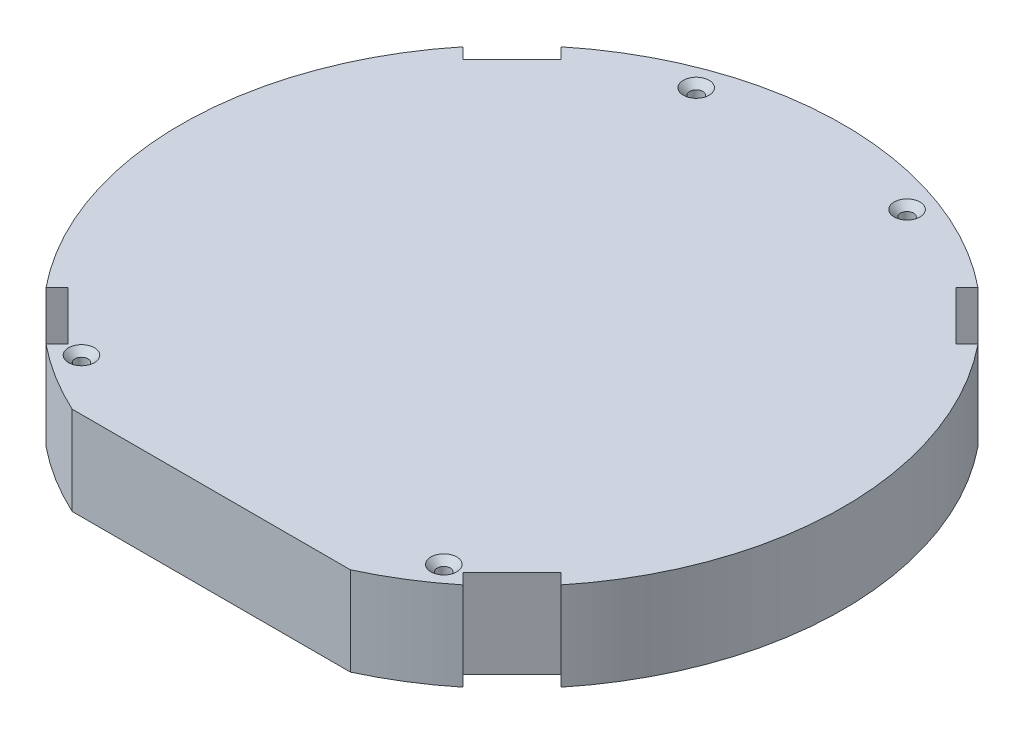
ISO-10303-21;
HEADER;
FILE_DESCRIPTION(('STEP AP214'),'2;1');
FILE_NAME('part.step','',(''),(''),'','','');
FILE_SCHEMA(('AUTOMOTIVE_DESIGN { 1 0 10303 214 1 1 1 1 }'));
ENDSEC;
DATA;
#1=APPLICATION_CONTEXT('core data for automotive mechanical design processes');
#2=APPLICATION_PROTOCOL_DEFINITION('international standard','automotive_design',2000,#1);
#3=PRODUCT_CONTEXT('',#1,'mechanical');
#4=PRODUCT('Part','Part','',(#3));
#5=PRODUCT_RELATED_PRODUCT_CATEGORY('part','',(#4));
#6=PRODUCT_DEFINITION_FORMATION('','',#4);
#7=PRODUCT_DEFINITION_CONTEXT('part definition',#1,'design');
#8=PRODUCT_DEFINITION('design','',#6,#7);
#9=PRODUCT_DEFINITION_SHAPE('','',#8);
#10=(LENGTH_UNIT() NAMED_UNIT(*) SI_UNIT(.MILLI.,.METRE.));
#11=(NAMED_UNIT(*) PLANE_ANGLE_UNIT() SI_UNIT($,.RADIAN.));
#12=(NAMED_UNIT(*) SI_UNIT($,.STERADIAN.) SOLID_ANGLE_UNIT());
#13=UNCERTAINTY_MEASURE_WITH_UNIT(LENGTH_MEASURE(1.E-05),#10,'distance_accuracy_value','');
#14=(GEOMETRIC_REPRESENTATION_CONTEXT(3) GLOBAL_UNCERTAINTY_ASSIGNED_CONTEXT((#13)) GLOBAL_UNIT_ASSIGNED_CONTEXT((#10,
#11,#12)) REPRESENTATION_CONTEXT('',''));
#15=CARTESIAN_POINT('',(0.,0.,0.));
#16=DIRECTION('',(0.,0.,1.));
#17=DIRECTION('',(1.,0.,0.));
#18=AXIS2_PLACEMENT_3D('',#15,#16,#17);
#19=CARTESIAN_POINT('',(0.,23.,0.));
#20=DIRECTION('',(0.,-1.,0.));
#21=DIRECTION('',(0.,0.,-1.));
#22=AXIS2_PLACEMENT_3D('',#19,#20,#21);
#23=CYLINDRICAL_SURFACE('',#22,85.9999999999999);
#24=CARTESIAN_POINT('',(0.,0.,0.));
#25=DIRECTION('',(0.,1.,0.));
#26=DIRECTION('',(0.,0.,1.));
#27=AXIS2_PLACEMENT_3D('',#24,#25,#26);
#28=CIRCLE('',#27,85.9999999999999);
#29=CARTESIAN_POINT('',(-54.1133074261559,0.,66.8412294875125));
#30=VERTEX_POINT('',#29);
#31=CARTESIAN_POINT('',(-36.1,0.,78.0563258166819));
#32=VERTEX_POINT('',#31);
#33=EDGE_CURVE('E292',#30,#32,#28,.T.);
#34=ORIENTED_EDGE('',*,*,#33,.T.);
#35=DIRECTION('',(0.,-1.,0.));
#36=VECTOR('',#35,1.);
#37=CARTESIAN_POINT('',(-36.1,23.,78.0563258166819));
#38=LINE('',#37,#36);
#39=CARTESIAN_POINT('',(-36.1,23.,78.0563258166819));
#40=VERTEX_POINT('',#39);
#41=EDGE_CURVE('E11',#40,#32,#38,.T.);
#42=ORIENTED_EDGE('',*,*,#41,.F.);
#43=CARTESIAN_POINT('',(0.,23.,0.));
#44=DIRECTION('',(0.,1.,0.));
#45=DIRECTION('',(0.,0.,1.));
#46=AXIS2_PLACEMENT_3D('',#43,#44,#45);
#47=CIRCLE('',#46,85.9999999999999);
#48=CARTESIAN_POINT('',(-54.1133074261559,23.,66.8412294875125));
#49=VERTEX_POINT('',#48);
#50=EDGE_CURVE('E293',#49,#40,#47,.T.);
#51=ORIENTED_EDGE('',*,*,#50,.F.);
#52=DIRECTION('',(0.,-1.,0.));
#53=VECTOR('',#52,1.);
#54=CARTESIAN_POINT('',(-54.1133074261559,23.,66.8412294875125));
#55=LINE('',#54,#53);
#56=EDGE_CURVE('E309',#49,#30,#55,.T.);
#57=ORIENTED_EDGE('',*,*,#56,.T.);
#58=EDGE_LOOP('',(#34,#42,#51,#57));
#59=FACE_BOUND('',#58,.T.);
#60=ADVANCED_FACE('F37',(#59),#23,.T.);
#61=CARTESIAN_POINT('',(36.1,23.,78.0563258166819));
#62=DIRECTION('',(0.,0.,-1.));
#63=DIRECTION('',(-1.,0.,0.));
#64=AXIS2_PLACEMENT_3D('',#61,#62,#63);
#65=PLANE('',#64);
#66=DIRECTION('',(1.,0.,0.));
#67=VECTOR('',#66,1.);
#68=CARTESIAN_POINT('',(36.1,0.,78.0563258166819));
#69=LINE('',#68,#67);
#70=CARTESIAN_POINT('',(36.1,0.,78.0563258166819));
#71=VERTEX_POINT('',#70);
#72=EDGE_CURVE('E312',#32,#71,#69,.T.);
#73=ORIENTED_EDGE('',*,*,#72,.T.);
#74=DIRECTION('',(0.,-1.,0.));
#75=VECTOR('',#74,1.);
#76=CARTESIAN_POINT('',(36.1,23.,78.0563258166819));
#77=LINE('',#76,#75);
#78=CARTESIAN_POINT('',(36.1,23.,78.0563258166819));
#79=VERTEX_POINT('',#78);
#80=EDGE_CURVE('E44',#79,#71,#77,.T.);
#81=ORIENTED_EDGE('',*,*,#80,.F.);
#82=DIRECTION('',(1.,0.,0.));
#83=VECTOR('',#82,1.);
#84=CARTESIAN_POINT('',(36.1,23.,78.0563258166819));
#85=LINE('',#84,#83);
#86=EDGE_CURVE('E296',#40,#79,#85,.T.);
#87=ORIENTED_EDGE('',*,*,#86,.F.);
#88=ORIENTED_EDGE('',*,*,#41,.T.);
#89=EDGE_LOOP('',(#73,#81,#87,#88));
#90=FACE_BOUND('',#89,.T.);
#91=ADVANCED_FACE('F362',(#90),#65,.F.);
#92=CARTESIAN_POINT('',(0.,23.,0.));
#93=DIRECTION('',(0.,-1.,0.));
#94=DIRECTION('',(0.,0.,-1.));
#95=AXIS2_PLACEMENT_3D('',#92,#93,#94);
#96=CYLINDRICAL_SURFACE('',#95,85.9999999999999);
#97=CARTESIAN_POINT('',(0.,0.,0.));
#98=DIRECTION('',(0.,1.,0.));
#99=DIRECTION('',(0.,0.,1.));
#100=AXIS2_PLACEMENT_3D('',#97,#98,#99);
#101=CIRCLE('',#100,85.9999999999999);
#102=CARTESIAN_POINT('',(54.1133074261559,0.,66.8412294875125));
#103=VERTEX_POINT('',#102);
#104=EDGE_CURVE('E314',#71,#103,#101,.T.);
#105=ORIENTED_EDGE('',*,*,#104,.T.);
#106=DIRECTION('',(0.,-1.,0.));
#107=VECTOR('',#106,1.);
#108=CARTESIAN_POINT('',(54.1133074261556,23.,66.8412294875129));
#109=LINE('',#108,#107);
#110=CARTESIAN_POINT('',(54.1133074261559,23.,66.8412294875125));
#111=VERTEX_POINT('',#110);
#112=EDGE_CURVE('E342',#111,#103,#109,.T.);
#113=ORIENTED_EDGE('',*,*,#112,.F.);
#114=CARTESIAN_POINT('',(0.,23.,0.));
#115=DIRECTION('',(0.,1.,0.));
#116=DIRECTION('',(0.,0.,1.));
#117=AXIS2_PLACEMENT_3D('',#114,#115,#116);
#118=CIRCLE('',#117,85.9999999999999);
#119=EDGE_CURVE('E299',#79,#111,#118,.T.);
#120=ORIENTED_EDGE('',*,*,#119,.F.);
#121=ORIENTED_EDGE('',*,*,#80,.T.);
#122=EDGE_LOOP('',(#105,#113,#120,#121));
#123=FACE_BOUND('',#122,.T.);
#124=ADVANCED_FACE('F348',(#123),#96,.T.);
#125=CARTESIAN_POINT('',(0.,23.,0.));
#126=DIRECTION('',(0.,-1.,0.));
#127=DIRECTION('',(0.,0.,-1.));
#128=AXIS2_PLACEMENT_3D('',#125,#126,#127);
#129=CYLINDRICAL_SURFACE('',#128,86.);
#130=CARTESIAN_POINT('',(0.,0.,0.));
#131=DIRECTION('',(0.,1.,0.));
#132=DIRECTION('',(0.,0.,1.));
#133=AXIS2_PLACEMENT_3D('',#130,#131,#132);
#134=CIRCLE('',#133,86.);
#135=CARTESIAN_POINT('',(66.8412294875138,0.,54.1133074261547));
#136=VERTEX_POINT('',#135);
#137=CARTESIAN_POINT('',(66.8412294875138,0.,-54.1133074261547));
#138=VERTEX_POINT('',#137);
#139=EDGE_CURVE('E317',#136,#138,#134,.T.);
#140=ORIENTED_EDGE('',*,*,#139,.T.);
#141=DIRECTION('',(0.,-1.,0.));
#142=VECTOR('',#141,1.);
#143=CARTESIAN_POINT('',(66.841229487513,23.,-54.1133074261557));
#144=LINE('',#143,#142);
#145=CARTESIAN_POINT('',(66.8412294875138,23.,-54.1133074261547));
#146=VERTEX_POINT('',#145);
#147=EDGE_CURVE('E337',#146,#138,#144,.T.);
#148=ORIENTED_EDGE('',*,*,#147,.F.);
#149=CARTESIAN_POINT('',(0.,23.,0.));
#150=DIRECTION('',(0.,1.,0.));
#151=DIRECTION('',(0.,0.,1.));
#152=AXIS2_PLACEMENT_3D('',#149,#150,#151);
#153=CIRCLE('',#152,86.);
#154=CARTESIAN_POINT('',(66.8412294875138,23.,54.1133074261547));
#155=VERTEX_POINT('',#154);
#156=EDGE_CURVE('E186',#155,#146,#153,.T.);
#157=ORIENTED_EDGE('',*,*,#156,.F.);
#158=DIRECTION('',(0.,-1.,0.));
#159=VECTOR('',#158,1.);
#160=CARTESIAN_POINT('',(66.8412294875135,23.,54.113307426155));
#161=LINE('',#160,#159);
#162=EDGE_CURVE('E339',#155,#136,#161,.T.);
#163=ORIENTED_EDGE('',*,*,#162,.T.);
#164=EDGE_LOOP('',(#140,#148,#157,#163));
#165=FACE_BOUND('',#164,.T.);
#166=ADVANCED_FACE('F395',(#165),#129,.T.);
#167=CARTESIAN_POINT('',(0.,23.,0.));
#168=DIRECTION('',(0.,-1.,0.));
#169=DIRECTION('',(0.,0.,-1.));
#170=AXIS2_PLACEMENT_3D('',#167,#168,#169);
#171=CYLINDRICAL_SURFACE('',#170,86.);
#172=CARTESIAN_POINT('',(0.,0.,0.));
#173=DIRECTION('',(0.,1.,0.));
#174=DIRECTION('',(0.,0.,1.));
#175=AXIS2_PLACEMENT_3D('',#172,#173,#174);
#176=CIRCLE('',#175,86.);
#177=CARTESIAN_POINT('',(54.1133074261559,0.,-66.8412294875125));
#178=VERTEX_POINT('',#177);
#179=CARTESIAN_POINT('',(-54.1133074261559,0.,-66.8412294875125));
#180=VERTEX_POINT('',#179);
#181=EDGE_CURVE('E320',#178,#180,#176,.T.);
#182=ORIENTED_EDGE('',*,*,#181,.T.);
#183=DIRECTION('',(0.,-1.,0.));
#184=VECTOR('',#183,1.);
#185=CARTESIAN_POINT('',(-54.113307426155,23.,-66.8412294875135));
#186=LINE('',#185,#184);
#187=CARTESIAN_POINT('',(-54.1133074261559,23.,-66.8412294875125));
#188=VERTEX_POINT('',#187);
#189=EDGE_CURVE('E332',#188,#180,#186,.T.);
#190=ORIENTED_EDGE('',*,*,#189,.F.);
#191=CARTESIAN_POINT('',(0.,23.,0.));
#192=DIRECTION('',(0.,1.,0.));
#193=DIRECTION('',(0.,0.,1.));
#194=AXIS2_PLACEMENT_3D('',#191,#192,#193);
#195=CIRCLE('',#194,86.);
#196=CARTESIAN_POINT('',(54.1133074261559,23.,-66.8412294875125));
#197=VERTEX_POINT('',#196);
#198=EDGE_CURVE('E303',#197,#188,#195,.T.);
#199=ORIENTED_EDGE('',*,*,#198,.F.);
#200=DIRECTION('',(0.,-1.,0.));
#201=VECTOR('',#200,1.);
#202=CARTESIAN_POINT('',(54.113307426155,23.,-66.8412294875134));
#203=LINE('',#202,#201);
#204=EDGE_CURVE('E334',#197,#178,#203,.T.);
#205=ORIENTED_EDGE('',*,*,#204,.T.);
#206=EDGE_LOOP('',(#182,#190,#199,#205));
#207=FACE_BOUND('',#206,.T.);
#208=ADVANCED_FACE('F389',(#207),#171,.T.);
#209=CARTESIAN_POINT('',(0.,23.,0.));
#210=DIRECTION('',(0.,-1.,0.));
#211=DIRECTION('',(0.,0.,-1.));
#212=AXIS2_PLACEMENT_3D('',#209,#210,#211);
#213=CYLINDRICAL_SURFACE('',#212,86.0000000000001);
#214=CARTESIAN_POINT('',(0.,0.,0.));
#215=DIRECTION('',(0.,1.,0.));
#216=DIRECTION('',(0.,0.,1.));
#217=AXIS2_PLACEMENT_3D('',#214,#215,#216);
#218=CIRCLE('',#217,86.0000000000001);
#219=CARTESIAN_POINT('',(-66.8412294875138,0.,-54.1133074261547));
#220=VERTEX_POINT('',#219);
#221=CARTESIAN_POINT('',(-66.8412294875138,0.,54.1133074261547));
#222=VERTEX_POINT('',#221);
#223=EDGE_CURVE('E297',#220,#222,#218,.T.);
#224=ORIENTED_EDGE('',*,*,#223,.T.);
#225=DIRECTION('',(0.,-1.,0.));
#226=VECTOR('',#225,1.);
#227=CARTESIAN_POINT('',(-66.8412294875138,23.,54.1133074261547));
#228=LINE('',#227,#226);
#229=CARTESIAN_POINT('',(-66.8412294875138,23.,54.1133074261547));
#230=VERTEX_POINT('',#229);
#231=EDGE_CURVE('E327',#230,#222,#228,.T.);
#232=ORIENTED_EDGE('',*,*,#231,.F.);
#233=CARTESIAN_POINT('',(0.,23.,0.));
#234=DIRECTION('',(0.,1.,0.));
#235=DIRECTION('',(0.,0.,1.));
#236=AXIS2_PLACEMENT_3D('',#233,#234,#235);
#237=CIRCLE('',#236,86.0000000000001);
#238=CARTESIAN_POINT('',(-66.8412294875138,23.,-54.1133074261547));
#239=VERTEX_POINT('',#238);
#240=EDGE_CURVE('E306',#239,#230,#237,.T.);
#241=ORIENTED_EDGE('',*,*,#240,.F.);
#242=DIRECTION('',(0.,-1.,0.));
#243=VECTOR('',#242,1.);
#244=CARTESIAN_POINT('',(-66.8412294875129,23.,-54.1133074261556));
#245=LINE('',#244,#243);
#246=EDGE_CURVE('E329',#239,#220,#245,.T.);
#247=ORIENTED_EDGE('',*,*,#246,.T.);
#248=EDGE_LOOP('',(#224,#232,#241,#247));
#249=FACE_BOUND('',#248,.T.);
#250=ADVANCED_FACE('F377',(#249),#213,.T.);
#251=CARTESIAN_POINT('',(0.,23.,0.));
#252=DIRECTION('',(0.,1.,0.));
#253=DIRECTION('',(0.,0.,1.));
#254=AXIS2_PLACEMENT_3D('',#251,#252,#253);
#255=PLANE('',#254);
#256=DIRECTION('',(-0.707106781186546,0.,-0.707106781186549));
#257=VECTOR('',#256,1.);
#258=CARTESIAN_POINT('',(-51.2848803014098,23.,-64.0128023627663));
#259=LINE('',#258,#257);
#260=CARTESIAN_POINT('',(-51.2848803014098,23.,-64.0128023627663));
#261=VERTEX_POINT('',#260);
#262=EDGE_CURVE('E206',#261,#188,#259,.T.);
#263=ORIENTED_EDGE('',*,*,#262,.F.);
#264=DIRECTION('',(0.707106781186549,0.,-0.707106781186546));
#265=VECTOR('',#264,1.);
#266=CARTESIAN_POINT('',(-64.0128023627677,23.,-51.2848803014085));
#267=LINE('',#266,#265);
#268=CARTESIAN_POINT('',(-64.0128023627677,23.,-51.2848803014085));
#269=VERTEX_POINT('',#268);
#270=EDGE_CURVE('E208',#269,#261,#267,.T.);
#271=ORIENTED_EDGE('',*,*,#270,.F.);
#272=DIRECTION('',(0.707106781186542,0.,0.707106781186553));
#273=VECTOR('',#272,1.);
#274=CARTESIAN_POINT('',(-66.8412294875138,23.,-54.1133074261547));
#275=LINE('',#274,#273);
#276=EDGE_CURVE('E212',#239,#269,#275,.T.);
#277=ORIENTED_EDGE('',*,*,#276,.F.);
#278=ORIENTED_EDGE('',*,*,#240,.T.);
#279=DIRECTION('',(-0.707106781186545,0.,0.70710678118655));
#280=VECTOR('',#279,1.);
#281=CARTESIAN_POINT('',(-66.8412294875138,23.,54.1133074261547));
#282=LINE('',#281,#280);
#283=CARTESIAN_POINT('',(-64.0128023627676,23.,51.2848803014085));
#284=VERTEX_POINT('',#283);
#285=EDGE_CURVE('E240',#284,#230,#282,.T.);
#286=ORIENTED_EDGE('',*,*,#285,.F.);
#287=DIRECTION('',(-0.70710678118655,0.,-0.707106781186545));
#288=VECTOR('',#287,1.);
#289=CARTESIAN_POINT('',(-64.0128023627676,23.,51.2848803014085));
#290=LINE('',#289,#288);
#291=CARTESIAN_POINT('',(-51.2848803014097,23.,64.0128023627663));
#292=VERTEX_POINT('',#291);
#293=EDGE_CURVE('E249',#292,#284,#290,.T.);
#294=ORIENTED_EDGE('',*,*,#293,.F.);
#295=DIRECTION('',(0.707106781186545,0.,-0.70710678118655));
#296=VECTOR('',#295,1.);
#297=CARTESIAN_POINT('',(-51.2848803014097,23.,64.0128023627663));
#298=LINE('',#297,#296);
#299=EDGE_CURVE('E215',#49,#292,#298,.T.);
#300=ORIENTED_EDGE('',*,*,#299,.F.);
#301=ORIENTED_EDGE('',*,*,#50,.T.);
#302=ORIENTED_EDGE('',*,*,#86,.T.);
#303=ORIENTED_EDGE('',*,*,#119,.T.);
#304=DIRECTION('',(0.707106781186546,0.,0.707106781186549));
#305=VECTOR('',#304,1.);
#306=CARTESIAN_POINT('',(51.2848803014098,23.,64.0128023627663));
#307=LINE('',#306,#305);
#308=CARTESIAN_POINT('',(51.2848803014098,23.,64.0128023627663));
#309=VERTEX_POINT('',#308);
#310=EDGE_CURVE('E223',#309,#111,#307,.T.);
#311=ORIENTED_EDGE('',*,*,#310,.F.);
#312=DIRECTION('',(-0.707106781186549,0.,0.707106781186546));
#313=VECTOR('',#312,1.);
#314=CARTESIAN_POINT('',(64.0128023627677,23.,51.2848803014085));
#315=LINE('',#314,#313);
#316=CARTESIAN_POINT('',(64.0128023627677,23.,51.2848803014085));
#317=VERTEX_POINT('',#316);
#318=EDGE_CURVE('E225',#317,#309,#315,.T.);
#319=ORIENTED_EDGE('',*,*,#318,.F.);
#320=DIRECTION('',(-0.707106781186542,0.,-0.707106781186553));
#321=VECTOR('',#320,1.);
#322=CARTESIAN_POINT('',(66.8412294875138,23.,54.1133074261547));
#323=LINE('',#322,#321);
#324=EDGE_CURVE('E205',#155,#317,#323,.T.);
#325=ORIENTED_EDGE('',*,*,#324,.F.);
#326=ORIENTED_EDGE('',*,*,#156,.T.);
#327=DIRECTION('',(0.707106781186542,0.,-0.707106781186553));
#328=VECTOR('',#327,1.);
#329=CARTESIAN_POINT('',(66.8412294875138,23.,-54.1133074261547));
#330=LINE('',#329,#328);
#331=CARTESIAN_POINT('',(64.0128023627677,23.,-51.2848803014085));
#332=VERTEX_POINT('',#331);
#333=EDGE_CURVE('E164',#332,#146,#330,.T.);
#334=ORIENTED_EDGE('',*,*,#333,.F.);
#335=DIRECTION('',(0.70710678118655,0.,0.707106781186545));
#336=VECTOR('',#335,1.);
#337=CARTESIAN_POINT('',(64.0128023627677,23.,-51.2848803014085));
#338=LINE('',#337,#336);
#339=CARTESIAN_POINT('',(51.2848803014097,23.,-64.0128023627663));
#340=VERTEX_POINT('',#339);
#341=EDGE_CURVE('E173',#340,#332,#338,.T.);
#342=ORIENTED_EDGE('',*,*,#341,.F.);
#343=DIRECTION('',(-0.707106781186546,0.,0.707106781186549));
#344=VECTOR('',#343,1.);
#345=CARTESIAN_POINT('',(51.2848803014097,23.,-64.0128023627663));
#346=LINE('',#345,#344);
#347=EDGE_CURVE('E179',#197,#340,#346,.T.);
#348=ORIENTED_EDGE('',*,*,#347,.F.);
#349=ORIENTED_EDGE('',*,*,#198,.T.);
#350=EDGE_LOOP('',(#263,#271,#277,#278,#286,#294,#300,#301,#302,#303,#311,#319,#325,#326,#334,
#342,#348,#349));
#351=FACE_BOUND('',#350,.T.);
#352=CARTESIAN_POINT('',(47.0228201833975,23.,64.7213595499961));
#353=DIRECTION('',(0.,1.,0.));
#354=DIRECTION('',(0.,0.,1.));
#355=AXIS2_PLACEMENT_3D('',#352,#353,#354);
#356=CIRCLE('',#355,3.36);
#357=CARTESIAN_POINT('',(47.0228201833975,23.,68.0813595499961));
#358=VERTEX_POINT('',#357);
#359=EDGE_CURVE('E255',#358,#358,#356,.T.);
#360=ORIENTED_EDGE('',*,*,#359,.F.);
#361=EDGE_LOOP('',(#360));
#362=FACE_BOUND('',#361,.T.);
#363=CARTESIAN_POINT('',(27.361611466053,23.,-75.1754096628728));
#364=DIRECTION('',(0.,1.,0.));
#365=DIRECTION('',(0.,0.,1.));
#366=AXIS2_PLACEMENT_3D('',#363,#364,#365);
#367=CIRCLE('',#366,3.36);
#368=CARTESIAN_POINT('',(27.361611466053,23.,-71.8154096628728));
#369=VERTEX_POINT('',#368);
#370=EDGE_CURVE('E265',#369,#369,#367,.T.);
#371=ORIENTED_EDGE('',*,*,#370,.F.);
#372=EDGE_LOOP('',(#371));
#373=FACE_BOUND('',#372,.T.);
#374=CARTESIAN_POINT('',(-47.0228201833975,23.,64.7213595499961));
#375=DIRECTION('',(0.,1.,0.));
#376=DIRECTION('',(0.,0.,1.));
#377=AXIS2_PLACEMENT_3D('',#374,#375,#376);
#378=CIRCLE('',#377,3.36);
#379=CARTESIAN_POINT('',(-47.0228201833975,23.,68.0813595499961));
#380=VERTEX_POINT('',#379);
#381=EDGE_CURVE('E274',#380,#380,#378,.T.);
#382=ORIENTED_EDGE('',*,*,#381,.F.);
#383=EDGE_LOOP('',(#382));
#384=FACE_BOUND('',#383,.T.);
#385=CARTESIAN_POINT('',(-27.361611466053,23.,-75.1754096628728));
#386=DIRECTION('',(0.,1.,0.));
#387=DIRECTION('',(0.,0.,1.));
#388=AXIS2_PLACEMENT_3D('',#385,#386,#387);
#389=CIRCLE('',#388,3.36);
#390=CARTESIAN_POINT('',(-27.361611466053,23.,-71.8154096628728));
#391=VERTEX_POINT('',#390);
#392=EDGE_CURVE('E283',#391,#391,#389,.T.);
#393=ORIENTED_EDGE('',*,*,#392,.F.);
#394=EDGE_LOOP('',(#393));
#395=FACE_BOUND('',#394,.T.);
#396=ADVANCED_FACE('F182',(#351,#362,#373,#384,#395),#255,.T.);
#397=CARTESIAN_POINT('',(0.,0.,0.));
#398=DIRECTION('',(0.,1.,0.));
#399=DIRECTION('',(0.,0.,1.));
#400=AXIS2_PLACEMENT_3D('',#397,#398,#399);
#401=PLANE('',#400);
#402=CARTESIAN_POINT('',(47.0228201833975,0.,64.7213595499961));
#403=DIRECTION('',(0.,1.,0.));
#404=DIRECTION('',(0.,0.,1.));
#405=AXIS2_PLACEMENT_3D('',#402,#403,#404);
#406=CIRCLE('',#405,1.69999999999999);
#407=CARTESIAN_POINT('',(47.0228201833975,0.,66.4213595499961));
#408=VERTEX_POINT('',#407);
#409=EDGE_CURVE('E262',#408,#408,#406,.T.);
#410=ORIENTED_EDGE('',*,*,#409,.T.);
#411=EDGE_LOOP('',(#410));
#412=FACE_BOUND('',#411,.T.);
#413=CARTESIAN_POINT('',(27.361611466053,0.,-75.1754096628728));
#414=DIRECTION('',(0.,1.,0.));
#415=DIRECTION('',(0.,0.,1.));
#416=AXIS2_PLACEMENT_3D('',#413,#414,#415);
#417=CIRCLE('',#416,1.69999999999999);
#418=CARTESIAN_POINT('',(27.361611466053,0.,-73.4754096628728));
#419=VERTEX_POINT('',#418);
#420=EDGE_CURVE('E271',#419,#419,#417,.T.);
#421=ORIENTED_EDGE('',*,*,#420,.T.);
#422=EDGE_LOOP('',(#421));
#423=FACE_BOUND('',#422,.T.);
#424=CARTESIAN_POINT('',(-47.0228201833975,0.,64.7213595499961));
#425=DIRECTION('',(0.,1.,0.));
#426=DIRECTION('',(0.,0.,1.));
#427=AXIS2_PLACEMENT_3D('',#424,#425,#426);
#428=CIRCLE('',#427,1.69999999999999);
#429=CARTESIAN_POINT('',(-47.0228201833975,0.,66.4213595499961));
#430=VERTEX_POINT('',#429);
#431=EDGE_CURVE('E280',#430,#430,#428,.T.);
#432=ORIENTED_EDGE('',*,*,#431,.T.);
#433=EDGE_LOOP('',(#432));
#434=FACE_BOUND('',#433,.T.);
#435=CARTESIAN_POINT('',(-27.361611466053,0.,-75.1754096628728));
#436=DIRECTION('',(0.,1.,0.));
#437=DIRECTION('',(0.,0.,1.));
#438=AXIS2_PLACEMENT_3D('',#435,#436,#437);
#439=CIRCLE('',#438,1.69999999999999);
#440=CARTESIAN_POINT('',(-27.361611466053,0.,-73.4754096628728));
#441=VERTEX_POINT('',#440);
#442=EDGE_CURVE('E289',#441,#441,#439,.T.);
#443=ORIENTED_EDGE('',*,*,#442,.T.);
#444=EDGE_LOOP('',(#443));
#445=FACE_BOUND('',#444,.T.);
#446=DIRECTION('',(0.707106781186549,0.,-0.707106781186546));
#447=VECTOR('',#446,1.);
#448=CARTESIAN_POINT('',(-64.0128023627677,0.,-51.2848803014085));
#449=LINE('',#448,#447);
#450=CARTESIAN_POINT('',(-64.0128023627677,0.,-51.2848803014085));
#451=VERTEX_POINT('',#450);
#452=CARTESIAN_POINT('',(-51.2848803014098,0.,-64.0128023627663));
#453=VERTEX_POINT('',#452);
#454=EDGE_CURVE('E51',#451,#453,#449,.T.);
#455=ORIENTED_EDGE('',*,*,#454,.T.);
#456=DIRECTION('',(-0.707106781186546,0.,-0.707106781186549));
#457=VECTOR('',#456,1.);
#458=CARTESIAN_POINT('',(-51.2848803014098,0.,-64.0128023627663));
#459=LINE('',#458,#457);
#460=EDGE_CURVE('E202',#453,#180,#459,.T.);
#461=ORIENTED_EDGE('',*,*,#460,.T.);
#462=ORIENTED_EDGE('',*,*,#181,.F.);
#463=DIRECTION('',(-0.707106781186546,0.,0.707106781186549));
#464=VECTOR('',#463,1.);
#465=CARTESIAN_POINT('',(51.2848803014097,0.,-64.0128023627663));
#466=LINE('',#465,#464);
#467=CARTESIAN_POINT('',(51.2848803014097,0.,-64.0128023627663));
#468=VERTEX_POINT('',#467);
#469=EDGE_CURVE('E196',#178,#468,#466,.T.);
#470=ORIENTED_EDGE('',*,*,#469,.T.);
#471=DIRECTION('',(0.70710678118655,0.,0.707106781186545));
#472=VECTOR('',#471,1.);
#473=CARTESIAN_POINT('',(64.0128023627677,0.,-51.2848803014085));
#474=LINE('',#473,#472);
#475=CARTESIAN_POINT('',(64.0128023627677,0.,-51.2848803014085));
#476=VERTEX_POINT('',#475);
#477=EDGE_CURVE('E194',#468,#476,#474,.T.);
#478=ORIENTED_EDGE('',*,*,#477,.T.);
#479=DIRECTION('',(0.707106781186542,0.,-0.707106781186553));
#480=VECTOR('',#479,1.);
#481=CARTESIAN_POINT('',(66.8412294875138,0.,-54.1133074261547));
#482=LINE('',#481,#480);
#483=EDGE_CURVE('E167',#476,#138,#482,.T.);
#484=ORIENTED_EDGE('',*,*,#483,.T.);
#485=ORIENTED_EDGE('',*,*,#139,.F.);
#486=DIRECTION('',(-0.707106781186542,0.,-0.707106781186553));
#487=VECTOR('',#486,1.);
#488=CARTESIAN_POINT('',(66.8412294875138,0.,54.1133074261547));
#489=LINE('',#488,#487);
#490=CARTESIAN_POINT('',(64.0128023627677,0.,51.2848803014085));
#491=VERTEX_POINT('',#490);
#492=EDGE_CURVE('E226',#136,#491,#489,.T.);
#493=ORIENTED_EDGE('',*,*,#492,.T.);
#494=DIRECTION('',(-0.707106781186549,0.,0.707106781186546));
#495=VECTOR('',#494,1.);
#496=CARTESIAN_POINT('',(64.0128023627677,0.,51.2848803014085));
#497=LINE('',#496,#495);
#498=CARTESIAN_POINT('',(51.2848803014098,0.,64.0128023627663));
#499=VERTEX_POINT('',#498);
#500=EDGE_CURVE('E59',#491,#499,#497,.T.);
#501=ORIENTED_EDGE('',*,*,#500,.T.);
#502=DIRECTION('',(0.707106781186546,0.,0.707106781186549));
#503=VECTOR('',#502,1.);
#504=CARTESIAN_POINT('',(51.2848803014098,0.,64.0128023627663));
#505=LINE('',#504,#503);
#506=EDGE_CURVE('E221',#499,#103,#505,.T.);
#507=ORIENTED_EDGE('',*,*,#506,.T.);
#508=ORIENTED_EDGE('',*,*,#104,.F.);
#509=ORIENTED_EDGE('',*,*,#72,.F.);
#510=ORIENTED_EDGE('',*,*,#33,.F.);
#511=DIRECTION('',(0.707106781186545,0.,-0.70710678118655));
#512=VECTOR('',#511,1.);
#513=CARTESIAN_POINT('',(-51.2848803014097,0.,64.0128023627663));
#514=LINE('',#513,#512);
#515=CARTESIAN_POINT('',(-51.2848803014097,0.,64.0128023627663));
#516=VERTEX_POINT('',#515);
#517=EDGE_CURVE('E236',#30,#516,#514,.T.);
#518=ORIENTED_EDGE('',*,*,#517,.T.);
#519=DIRECTION('',(-0.70710678118655,0.,-0.707106781186545));
#520=VECTOR('',#519,1.);
#521=CARTESIAN_POINT('',(-64.0128023627676,0.,51.2848803014085));
#522=LINE('',#521,#520);
#523=CARTESIAN_POINT('',(-64.0128023627676,0.,51.2848803014085));
#524=VERTEX_POINT('',#523);
#525=EDGE_CURVE('E239',#516,#524,#522,.T.);
#526=ORIENTED_EDGE('',*,*,#525,.T.);
#527=DIRECTION('',(-0.707106781186545,0.,0.70710678118655));
#528=VECTOR('',#527,1.);
#529=CARTESIAN_POINT('',(-66.8412294875138,0.,54.1133074261547));
#530=LINE('',#529,#528);
#531=EDGE_CURVE('E243',#524,#222,#530,.T.);
#532=ORIENTED_EDGE('',*,*,#531,.T.);
#533=ORIENTED_EDGE('',*,*,#223,.F.);
#534=DIRECTION('',(0.707106781186542,0.,0.707106781186553));
#535=VECTOR('',#534,1.);
#536=CARTESIAN_POINT('',(-66.8412294875138,0.,-54.1133074261547));
#537=LINE('',#536,#535);
#538=EDGE_CURVE('E209',#220,#451,#537,.T.);
#539=ORIENTED_EDGE('',*,*,#538,.T.);
#540=EDGE_LOOP('',(#455,#461,#462,#470,#478,#484,#485,#493,#501,#507,#508,#509,#510,#518,#526,
#532,#533,#539));
#541=FACE_BOUND('',#540,.T.);
#542=ADVANCED_FACE('F352',(#412,#423,#434,#445,#541),#401,.F.);
#543=CARTESIAN_POINT('',(-27.361611466053,23.,-75.1754096628728));
#544=DIRECTION('',(0.,1.,0.));
#545=DIRECTION('',(0.,0.,1.));
#546=AXIS2_PLACEMENT_3D('',#543,#544,#545);
#547=CYLINDRICAL_SURFACE('',#546,1.69999999999999);
#548=ORIENTED_EDGE('',*,*,#442,.F.);
#549=EDGE_LOOP('',(#548));
#550=FACE_BOUND('',#549,.T.);
#551=CARTESIAN_POINT('',(-27.361611466053,21.34,-75.1754096628728));
#552=DIRECTION('',(0.,1.,0.));
#553=DIRECTION('',(0.,0.,1.));
#554=AXIS2_PLACEMENT_3D('',#551,#552,#553);
#555=CIRCLE('',#554,1.69999999999999);
#556=CARTESIAN_POINT('',(-27.361611466053,21.34,-73.4754096628729));
#557=VERTEX_POINT('',#556);
#558=EDGE_CURVE('E286',#557,#557,#555,.T.);
#559=ORIENTED_EDGE('',*,*,#558,.T.);
#560=EDGE_LOOP('',(#559));
#561=FACE_BOUND('',#560,.T.);
#562=ADVANCED_FACE('F425',(#550,#561),#547,.F.);
#563=CARTESIAN_POINT('',(-27.361611466053,23.,-75.1754096628728));
#564=DIRECTION('',(0.,1.,0.));
#565=DIRECTION('',(0.,0.,1.));
#566=AXIS2_PLACEMENT_3D('',#563,#564,#565);
#567=CONICAL_SURFACE('',#566,3.36,0.785398163397445);
#568=ORIENTED_EDGE('',*,*,#558,.F.);
#569=EDGE_LOOP('',(#568));
#570=FACE_BOUND('',#569,.T.);
#571=ORIENTED_EDGE('',*,*,#392,.T.);
#572=EDGE_LOOP('',(#571));
#573=FACE_BOUND('',#572,.T.);
#574=ADVANCED_FACE('F431',(#570,#573),#567,.F.);
#575=CARTESIAN_POINT('',(-47.0228201833975,23.,64.7213595499961));
#576=DIRECTION('',(0.,1.,0.));
#577=DIRECTION('',(0.,0.,1.));
#578=AXIS2_PLACEMENT_3D('',#575,#576,#577);
#579=CYLINDRICAL_SURFACE('',#578,1.69999999999999);
#580=ORIENTED_EDGE('',*,*,#431,.F.);
#581=EDGE_LOOP('',(#580));
#582=FACE_BOUND('',#581,.T.);
#583=CARTESIAN_POINT('',(-47.0228201833975,21.34,64.7213595499961));
#584=DIRECTION('',(0.,1.,0.));
#585=DIRECTION('',(0.,0.,1.));
#586=AXIS2_PLACEMENT_3D('',#583,#584,#585);
#587=CIRCLE('',#586,1.69999999999999);
#588=CARTESIAN_POINT('',(-47.0228201833975,21.34,66.4213595499961));
#589=VERTEX_POINT('',#588);
#590=EDGE_CURVE('E277',#589,#589,#587,.T.);
#591=ORIENTED_EDGE('',*,*,#590,.T.);
#592=EDGE_LOOP('',(#591));
#593=FACE_BOUND('',#592,.T.);
#594=ADVANCED_FACE('F435',(#582,#593),#579,.F.);
#595=CARTESIAN_POINT('',(-47.0228201833975,23.,64.7213595499961));
#596=DIRECTION('',(0.,1.,0.));
#597=DIRECTION('',(0.,0.,1.));
#598=AXIS2_PLACEMENT_3D('',#595,#596,#597);
#599=CONICAL_SURFACE('',#598,3.36,0.785398163397445);
#600=ORIENTED_EDGE('',*,*,#590,.F.);
#601=EDGE_LOOP('',(#600));
#602=FACE_BOUND('',#601,.T.);
#603=ORIENTED_EDGE('',*,*,#381,.T.);
#604=EDGE_LOOP('',(#603));
#605=FACE_BOUND('',#604,.T.);
#606=ADVANCED_FACE('F439',(#602,#605),#599,.F.);
#607=CARTESIAN_POINT('',(27.361611466053,23.,-75.1754096628728));
#608=DIRECTION('',(0.,1.,0.));
#609=DIRECTION('',(0.,0.,1.));
#610=AXIS2_PLACEMENT_3D('',#607,#608,#609);
#611=CYLINDRICAL_SURFACE('',#610,1.69999999999999);
#612=ORIENTED_EDGE('',*,*,#420,.F.);
#613=EDGE_LOOP('',(#612));
#614=FACE_BOUND('',#613,.T.);
#615=CARTESIAN_POINT('',(27.361611466053,21.34,-75.1754096628728));
#616=DIRECTION('',(0.,1.,0.));
#617=DIRECTION('',(0.,0.,1.));
#618=AXIS2_PLACEMENT_3D('',#615,#616,#617);
#619=CIRCLE('',#618,1.69999999999999);
#620=CARTESIAN_POINT('',(27.361611466053,21.34,-73.4754096628729));
#621=VERTEX_POINT('',#620);
#622=EDGE_CURVE('E268',#621,#621,#619,.T.);
#623=ORIENTED_EDGE('',*,*,#622,.T.);
#624=EDGE_LOOP('',(#623));
#625=FACE_BOUND('',#624,.T.);
#626=ADVANCED_FACE('F443',(#614,#625),#611,.F.);
#627=CARTESIAN_POINT('',(27.361611466053,23.,-75.1754096628728));
#628=DIRECTION('',(0.,1.,0.));
#629=DIRECTION('',(0.,0.,1.));
#630=AXIS2_PLACEMENT_3D('',#627,#628,#629);
#631=CONICAL_SURFACE('',#630,3.36,0.785398163397445);
#632=ORIENTED_EDGE('',*,*,#622,.F.);
#633=EDGE_LOOP('',(#632));
#634=FACE_BOUND('',#633,.T.);
#635=ORIENTED_EDGE('',*,*,#370,.T.);
#636=EDGE_LOOP('',(#635));
#637=FACE_BOUND('',#636,.T.);
#638=ADVANCED_FACE('F447',(#634,#637),#631,.F.);
#639=CARTESIAN_POINT('',(47.0228201833975,23.,64.7213595499961));
#640=DIRECTION('',(0.,1.,0.));
#641=DIRECTION('',(0.,0.,1.));
#642=AXIS2_PLACEMENT_3D('',#639,#640,#641);
#643=CYLINDRICAL_SURFACE('',#642,1.69999999999999);
#644=ORIENTED_EDGE('',*,*,#409,.F.);
#645=EDGE_LOOP('',(#644));
#646=FACE_BOUND('',#645,.T.);
#647=CARTESIAN_POINT('',(47.0228201833975,21.34,64.7213595499961));
#648=DIRECTION('',(0.,1.,0.));
#649=DIRECTION('',(0.,0.,1.));
#650=AXIS2_PLACEMENT_3D('',#647,#648,#649);
#651=CIRCLE('',#650,1.69999999999999);
#652=CARTESIAN_POINT('',(47.0228201833975,21.34,66.4213595499961));
#653=VERTEX_POINT('',#652);
#654=EDGE_CURVE('E259',#653,#653,#651,.T.);
#655=ORIENTED_EDGE('',*,*,#654,.T.);
#656=EDGE_LOOP('',(#655));
#657=FACE_BOUND('',#656,.T.);
#658=ADVANCED_FACE('F451',(#646,#657),#643,.F.);
#659=CARTESIAN_POINT('',(47.0228201833975,23.,64.7213595499961));
#660=DIRECTION('',(0.,1.,0.));
#661=DIRECTION('',(0.,0.,1.));
#662=AXIS2_PLACEMENT_3D('',#659,#660,#661);
#663=CONICAL_SURFACE('',#662,3.36,0.785398163397445);
#664=ORIENTED_EDGE('',*,*,#654,.F.);
#665=EDGE_LOOP('',(#664));
#666=FACE_BOUND('',#665,.T.);
#667=ORIENTED_EDGE('',*,*,#359,.T.);
#668=EDGE_LOOP('',(#667));
#669=FACE_BOUND('',#668,.T.);
#670=ADVANCED_FACE('F455',(#666,#669),#663,.F.);
#671=CARTESIAN_POINT('',(-66.8412294875138,0.,54.1133074261547));
#672=DIRECTION('',(-0.70710678118655,0.,-0.707106781186545));
#673=DIRECTION('',(-0.707106781186545,0.,0.70710678118655));
#674=AXIS2_PLACEMENT_3D('',#671,#672,#673);
#675=PLANE('',#674);
#676=ORIENTED_EDGE('',*,*,#285,.T.);
#677=ORIENTED_EDGE('',*,*,#231,.T.);
#678=ORIENTED_EDGE('',*,*,#531,.F.);
#679=DIRECTION('',(0.,1.,0.));
#680=VECTOR('',#679,1.);
#681=CARTESIAN_POINT('',(-64.0128023627676,0.,51.2848803014085));
#682=LINE('',#681,#680);
#683=EDGE_CURVE('E253',#524,#284,#682,.T.);
#684=ORIENTED_EDGE('',*,*,#683,.T.);
#685=EDGE_LOOP('',(#676,#677,#678,#684));
#686=FACE_BOUND('',#685,.T.);
#687=ADVANCED_FACE('F373',(#686),#675,.F.);
#688=CARTESIAN_POINT('',(-64.0128023627676,0.,51.2848803014085));
#689=DIRECTION('',(0.707106781186545,0.,-0.70710678118655));
#690=DIRECTION('',(-0.70710678118655,0.,-0.707106781186545));
#691=AXIS2_PLACEMENT_3D('',#688,#689,#690);
#692=PLANE('',#691);
#693=ORIENTED_EDGE('',*,*,#293,.T.);
#694=ORIENTED_EDGE('',*,*,#683,.F.);
#695=ORIENTED_EDGE('',*,*,#525,.F.);
#696=DIRECTION('',(0.,1.,0.));
#697=VECTOR('',#696,1.);
#698=CARTESIAN_POINT('',(-51.2848803014097,0.,64.0128023627663));
#699=LINE('',#698,#697);
#700=EDGE_CURVE('E246',#516,#292,#699,.T.);
#701=ORIENTED_EDGE('',*,*,#700,.T.);
#702=EDGE_LOOP('',(#693,#694,#695,#701));
#703=FACE_BOUND('',#702,.T.);
#704=ADVANCED_FACE('F369',(#703),#692,.F.);
#705=CARTESIAN_POINT('',(-51.2848803014097,0.,64.0128023627663));
#706=DIRECTION('',(0.70710678118655,0.,0.707106781186545));
#707=DIRECTION('',(0.707106781186545,0.,-0.70710678118655));
#708=AXIS2_PLACEMENT_3D('',#705,#706,#707);
#709=PLANE('',#708);
#710=ORIENTED_EDGE('',*,*,#299,.T.);
#711=ORIENTED_EDGE('',*,*,#700,.F.);
#712=ORIENTED_EDGE('',*,*,#517,.F.);
#713=ORIENTED_EDGE('',*,*,#56,.F.);
#714=EDGE_LOOP('',(#710,#711,#712,#713));
#715=FACE_BOUND('',#714,.T.);
#716=ADVANCED_FACE('F366',(#715),#709,.F.);
#717=CARTESIAN_POINT('',(66.8412294875138,0.,-54.1133074261547));
#718=DIRECTION('',(0.707106781186553,0.,0.707106781186542));
#719=DIRECTION('',(0.707106781186542,0.,-0.707106781186553));
#720=AXIS2_PLACEMENT_3D('',#717,#718,#719);
#721=PLANE('',#720);
#722=ORIENTED_EDGE('',*,*,#333,.T.);
#723=ORIENTED_EDGE('',*,*,#147,.T.);
#724=ORIENTED_EDGE('',*,*,#483,.F.);
#725=DIRECTION('',(0.,1.,0.));
#726=VECTOR('',#725,1.);
#727=CARTESIAN_POINT('',(64.0128023627677,0.,-51.2848803014085));
#728=LINE('',#727,#726);
#729=EDGE_CURVE('E160',#476,#332,#728,.T.);
#730=ORIENTED_EDGE('',*,*,#729,.T.);
#731=EDGE_LOOP('',(#722,#723,#724,#730));
#732=FACE_BOUND('',#731,.T.);
#733=ADVANCED_FACE('F162',(#732),#721,.F.);
#734=CARTESIAN_POINT('',(64.0128023627677,0.,-51.2848803014085));
#735=DIRECTION('',(-0.707106781186545,0.,0.70710678118655));
#736=DIRECTION('',(0.70710678118655,0.,0.707106781186545));
#737=AXIS2_PLACEMENT_3D('',#734,#735,#736);
#738=PLANE('',#737);
#739=ORIENTED_EDGE('',*,*,#341,.T.);
#740=ORIENTED_EDGE('',*,*,#729,.F.);
#741=ORIENTED_EDGE('',*,*,#477,.F.);
#742=DIRECTION('',(0.,1.,0.));
#743=VECTOR('',#742,1.);
#744=CARTESIAN_POINT('',(51.2848803014097,0.,-64.0128023627663));
#745=LINE('',#744,#743);
#746=EDGE_CURVE('E170',#468,#340,#745,.T.);
#747=ORIENTED_EDGE('',*,*,#746,.T.);
#748=EDGE_LOOP('',(#739,#740,#741,#747));
#749=FACE_BOUND('',#748,.T.);
#750=ADVANCED_FACE('F174',(#749),#738,.F.);
#751=CARTESIAN_POINT('',(51.2848803014097,0.,-64.0128023627663));
#752=DIRECTION('',(-0.707106781186549,0.,-0.707106781186546));
#753=DIRECTION('',(-0.707106781186546,0.,0.707106781186549));
#754=AXIS2_PLACEMENT_3D('',#751,#752,#753);
#755=PLANE('',#754);
#756=ORIENTED_EDGE('',*,*,#347,.T.);
#757=ORIENTED_EDGE('',*,*,#746,.F.);
#758=ORIENTED_EDGE('',*,*,#469,.F.);
#759=ORIENTED_EDGE('',*,*,#204,.F.);
#760=EDGE_LOOP('',(#756,#757,#758,#759));
#761=FACE_BOUND('',#760,.T.);
#762=ADVANCED_FACE('F392',(#761),#755,.F.);
#763=CARTESIAN_POINT('',(51.2848803014098,0.,64.0128023627663));
#764=DIRECTION('',(-0.707106781186549,0.,0.707106781186546));
#765=DIRECTION('',(0.707106781186546,0.,0.707106781186549));
#766=AXIS2_PLACEMENT_3D('',#763,#764,#765);
#767=PLANE('',#766);
#768=ORIENTED_EDGE('',*,*,#310,.T.);
#769=ORIENTED_EDGE('',*,*,#112,.T.);
#770=ORIENTED_EDGE('',*,*,#506,.F.);
#771=DIRECTION('',(0.,1.,0.));
#772=VECTOR('',#771,1.);
#773=CARTESIAN_POINT('',(51.2848803014098,0.,64.0128023627663));
#774=LINE('',#773,#772);
#775=EDGE_CURVE('E188',#499,#309,#774,.T.);
#776=ORIENTED_EDGE('',*,*,#775,.T.);
#777=EDGE_LOOP('',(#768,#769,#770,#776));
#778=FACE_BOUND('',#777,.T.);
#779=ADVANCED_FACE('F356',(#778),#767,.F.);
#780=CARTESIAN_POINT('',(64.0128023627677,0.,51.2848803014085));
#781=DIRECTION('',(-0.707106781186546,0.,-0.707106781186549));
#782=DIRECTION('',(-0.707106781186549,0.,0.707106781186546));
#783=AXIS2_PLACEMENT_3D('',#780,#781,#782);
#784=PLANE('',#783);
#785=ORIENTED_EDGE('',*,*,#318,.T.);
#786=ORIENTED_EDGE('',*,*,#775,.F.);
#787=ORIENTED_EDGE('',*,*,#500,.F.);
#788=DIRECTION('',(0.,1.,0.));
#789=VECTOR('',#788,1.);
#790=CARTESIAN_POINT('',(64.0128023627677,0.,51.2848803014085));
#791=LINE('',#790,#789);
#792=EDGE_CURVE('E190',#491,#317,#791,.T.);
#793=ORIENTED_EDGE('',*,*,#792,.T.);
#794=EDGE_LOOP('',(#785,#786,#787,#793));
#795=FACE_BOUND('',#794,.T.);
#796=ADVANCED_FACE('F398',(#795),#784,.F.);
#797=CARTESIAN_POINT('',(66.8412294875138,0.,54.1133074261547));
#798=DIRECTION('',(0.707106781186553,0.,-0.707106781186542));
#799=DIRECTION('',(-0.707106781186542,0.,-0.707106781186553));
#800=AXIS2_PLACEMENT_3D('',#797,#798,#799);
#801=PLANE('',#800);
#802=ORIENTED_EDGE('',*,*,#324,.T.);
#803=ORIENTED_EDGE('',*,*,#792,.F.);
#804=ORIENTED_EDGE('',*,*,#492,.F.);
#805=ORIENTED_EDGE('',*,*,#162,.F.);
#806=EDGE_LOOP('',(#802,#803,#804,#805));
#807=FACE_BOUND('',#806,.T.);
#808=ADVANCED_FACE('F397',(#807),#801,.F.);
#809=CARTESIAN_POINT('',(-51.2848803014098,0.,-64.0128023627663));
#810=DIRECTION('',(0.707106781186549,0.,-0.707106781186546));
#811=DIRECTION('',(-0.707106781186546,0.,-0.707106781186549));
#812=AXIS2_PLACEMENT_3D('',#809,#810,#811);
#813=PLANE('',#812);
#814=ORIENTED_EDGE('',*,*,#262,.T.);
#815=ORIENTED_EDGE('',*,*,#189,.T.);
#816=ORIENTED_EDGE('',*,*,#460,.F.);
#817=DIRECTION('',(0.,1.,0.));
#818=VECTOR('',#817,1.);
#819=CARTESIAN_POINT('',(-51.2848803014098,0.,-64.0128023627663));
#820=LINE('',#819,#818);
#821=EDGE_CURVE('E203',#453,#261,#820,.T.);
#822=ORIENTED_EDGE('',*,*,#821,.T.);
#823=EDGE_LOOP('',(#814,#815,#816,#822));
#824=FACE_BOUND('',#823,.T.);
#825=ADVANCED_FACE('F405',(#824),#813,.F.);
#826=CARTESIAN_POINT('',(-64.0128023627677,0.,-51.2848803014085));
#827=DIRECTION('',(0.707106781186546,0.,0.707106781186549));
#828=DIRECTION('',(0.707106781186549,0.,-0.707106781186546));
#829=AXIS2_PLACEMENT_3D('',#826,#827,#828);
#830=PLANE('',#829);
#831=ORIENTED_EDGE('',*,*,#270,.T.);
#832=ORIENTED_EDGE('',*,*,#821,.F.);
#833=ORIENTED_EDGE('',*,*,#454,.F.);
#834=DIRECTION('',(0.,1.,0.));
#835=VECTOR('',#834,1.);
#836=CARTESIAN_POINT('',(-64.0128023627677,0.,-51.2848803014085));
#837=LINE('',#836,#835);
#838=EDGE_CURVE('E200',#451,#269,#837,.T.);
#839=ORIENTED_EDGE('',*,*,#838,.T.);
#840=EDGE_LOOP('',(#831,#832,#833,#839));
#841=FACE_BOUND('',#840,.T.);
#842=ADVANCED_FACE('F383',(#841),#830,.F.);
#843=CARTESIAN_POINT('',(-66.8412294875138,0.,-54.1133074261547));
#844=DIRECTION('',(-0.707106781186553,0.,0.707106781186542));
#845=DIRECTION('',(0.707106781186542,0.,0.707106781186553));
#846=AXIS2_PLACEMENT_3D('',#843,#844,#845);
#847=PLANE('',#846);
#848=ORIENTED_EDGE('',*,*,#276,.T.);
#849=ORIENTED_EDGE('',*,*,#838,.F.);
#850=ORIENTED_EDGE('',*,*,#538,.F.);
#851=ORIENTED_EDGE('',*,*,#246,.F.);
#852=EDGE_LOOP('',(#848,#849,#850,#851));
#853=FACE_BOUND('',#852,.T.);
#854=ADVANCED_FACE('F381',(#853),#847,.F.);
#855=CLOSED_SHELL('',(#60,#91,#124,#166,#208,#250,#396,#542,#562,#574,#594,#606,#626,#638,#658,
#670,#687,#704,#716,#733,#750,#762,#779,#796,#808,#825,#842,#854));
#856=MANIFOLD_SOLID_BREP('B2',#855);
#857=ADVANCED_BREP_SHAPE_REPRESENTATION('',(#18,#856),#14);
#858=SHAPE_DEFINITION_REPRESENTATION(#9,#857);
ENDSEC;
END-ISO-10303-21;
